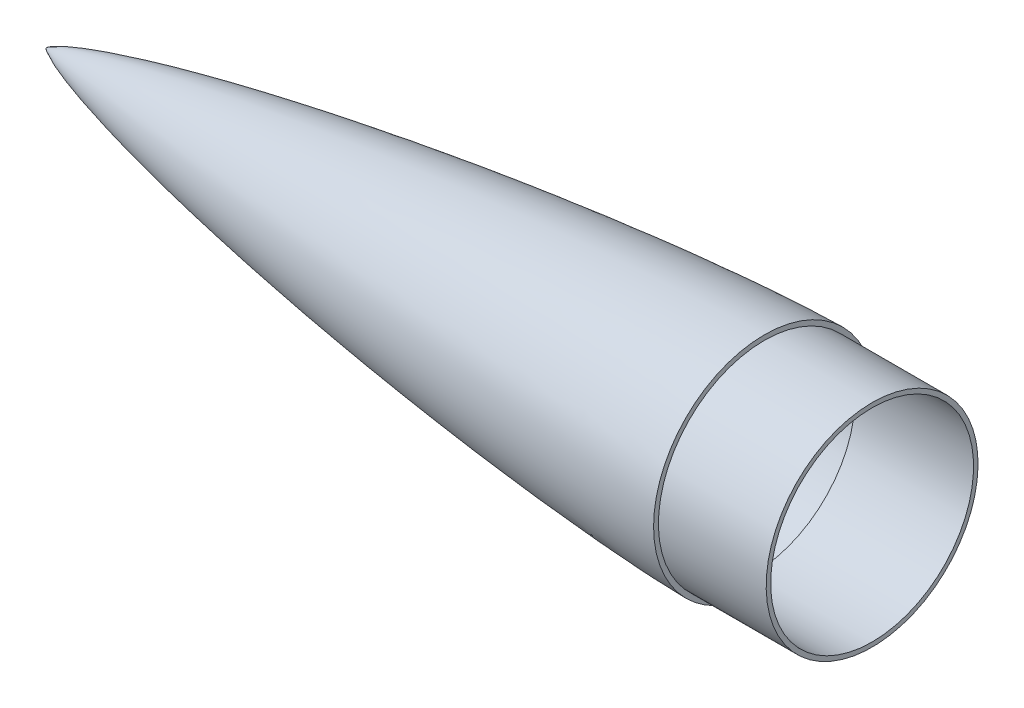
ISO-10303-21;
HEADER;
FILE_DESCRIPTION(('STEP AP214'),'2;1');
FILE_NAME('part.step','',(''),(''),'','','');
FILE_SCHEMA(('AUTOMOTIVE_DESIGN { 1 0 10303 214 1 1 1 1 }'));
ENDSEC;
DATA;
#1=APPLICATION_CONTEXT('core data for automotive mechanical design processes');
#2=APPLICATION_PROTOCOL_DEFINITION('international standard','automotive_design',2000,#1);
#3=PRODUCT_CONTEXT('',#1,'mechanical');
#4=PRODUCT('Part','Part','',(#3));
#5=PRODUCT_RELATED_PRODUCT_CATEGORY('part','',(#4));
#6=PRODUCT_DEFINITION_FORMATION('','',#4);
#7=PRODUCT_DEFINITION_CONTEXT('part definition',#1,'design');
#8=PRODUCT_DEFINITION('design','',#6,#7);
#9=PRODUCT_DEFINITION_SHAPE('','',#8);
#10=(LENGTH_UNIT() NAMED_UNIT(*) SI_UNIT(.MILLI.,.METRE.));
#11=(NAMED_UNIT(*) PLANE_ANGLE_UNIT() SI_UNIT($,.RADIAN.));
#12=(NAMED_UNIT(*) SI_UNIT($,.STERADIAN.) SOLID_ANGLE_UNIT());
#13=UNCERTAINTY_MEASURE_WITH_UNIT(LENGTH_MEASURE(1.E-05),#10,'distance_accuracy_value','');
#14=(GEOMETRIC_REPRESENTATION_CONTEXT(3) GLOBAL_UNCERTAINTY_ASSIGNED_CONTEXT((#13)) GLOBAL_UNIT_ASSIGNED_CONTEXT((#10,
#11,#12)) REPRESENTATION_CONTEXT('',''));
#15=CARTESIAN_POINT('',(0.,0.,0.));
#16=DIRECTION('',(0.,0.,1.));
#17=DIRECTION('',(1.,0.,0.));
#18=AXIS2_PLACEMENT_3D('',#15,#16,#17);
#19=CARTESIAN_POINT('',(6.35000000000002,0.,0.));
#20=CARTESIAN_POINT('',(8.88996624811629,0.941776102994665,0.));
#21=CARTESIAN_POINT('',(14.0024303116031,2.70221944007063,0.));
#22=CARTESIAN_POINT('',(24.4136822795864,5.96497194623063,0.));
#23=CARTESIAN_POINT('',(37.574073752206,9.66592160548296,0.));
#24=CARTESIAN_POINT('',(53.5019918591844,13.7360269665377,0.));
#25=CARTESIAN_POINT('',(74.8515412026572,18.791009133641,0.));
#26=CARTESIAN_POINT('',(101.687004562246,24.5668994346285,0.));
#27=CARTESIAN_POINT('',(134.032795497198,30.8802580053485,0.));
#28=CARTESIAN_POINT('',(166.48159120799,36.6971474107999,0.));
#29=CARTESIAN_POINT('',(209.85174440304,43.8892919328793,0.));
#30=CARTESIAN_POINT('',(264.223227054769,51.9420550282299,0.));
#31=CARTESIAN_POINT('',(329.654722931575,60.2836470172287,0.));
#32=CARTESIAN_POINT('',(384.3074472244,66.1446584278599,0.));
#33=CARTESIAN_POINT('',(428.093023223945,70.1027945695381,0.));
#34=CARTESIAN_POINT('',(460.962543932112,72.6561670831543,0.));
#35=CARTESIAN_POINT('',(485.061674690227,74.1684757365858,0.));
#36=CARTESIAN_POINT('',(498.20512214209,74.8262008817645,0.));
#37=CARTESIAN_POINT('',(500.38,74.93,0.));
#38=B_SPLINE_CURVE_WITH_KNOTS('',3,(#19,#20,#21,#22,#23,#24,#25,#26,#27,#28,#29,#30,#31,#32,#33,
#34,#35,#36,#37),.UNSPECIFIED.,.F.,.F.,(4,1,1,1,1,1,1,1,1,1,1,1,1,1,1,1,4),(0.0272717594964814,
0.0423729523571036,0.0574741452177258,0.0876765309389702,0.117878916660215,0.148081302381459,
0.208486073823948,0.268890845266437,0.329295616708925,0.389700388151414,0.510509931036392,
0.631319473921369,0.752129016806347,0.812533788248836,0.872938559691324,0.933343331133813,
0.945322528899407),.UNSPECIFIED.);
#39=CARTESIAN_POINT('',(508.,0.,0.));
#40=DIRECTION('',(1.,0.,0.));
#41=AXIS1_PLACEMENT('',#39,#40);
#42=SURFACE_OF_REVOLUTION('',#38,#41);
#43=CARTESIAN_POINT('',(500.38,0.,0.));
#44=DIRECTION('',(1.,0.,0.));
#45=DIRECTION('',(0.,1.,0.));
#46=AXIS2_PLACEMENT_3D('',#43,#44,#45);
#47=CIRCLE('',#46,74.9299999999999);
#48=CARTESIAN_POINT('',(500.38,74.93,0.));
#49=VERTEX_POINT('',#48);
#50=EDGE_CURVE('E11',#49,#49,#47,.T.);
#51=ORIENTED_EDGE('',*,*,#50,.T.);
#52=EDGE_LOOP('',(#51));
#53=FACE_BOUND('',#52,.T.);
#54=CARTESIAN_POINT('',(6.35,0.,0.));
#55=VERTEX_POINT('',#54);
#56=VERTEX_LOOP('',#55);
#57=FACE_BOUND('',#56,.T.);
#58=ADVANCED_FACE('F39',(#53,#57),#42,.F.);
#59=CARTESIAN_POINT('',(500.38,74.93,0.));
#60=DIRECTION('',(-1.,0.,0.));
#61=DIRECTION('',(0.,-1.,0.));
#62=AXIS2_PLACEMENT_3D('',#59,#60,#61);
#63=PLANE('',#62);
#64=CARTESIAN_POINT('',(500.38,0.,0.));
#65=DIRECTION('',(1.,0.,0.));
#66=DIRECTION('',(0.,1.,0.));
#67=AXIS2_PLACEMENT_3D('',#64,#65,#66);
#68=CIRCLE('',#67,71.755);
#69=CARTESIAN_POINT('',(500.38,71.7550000000001,0.));
#70=VERTEX_POINT('',#69);
#71=EDGE_CURVE('E48',#70,#70,#68,.T.);
#72=ORIENTED_EDGE('',*,*,#71,.T.);
#73=EDGE_LOOP('',(#72));
#74=FACE_BOUND('',#73,.T.);
#75=ORIENTED_EDGE('',*,*,#50,.F.);
#76=EDGE_LOOP('',(#75));
#77=FACE_BOUND('',#76,.T.);
#78=ADVANCED_FACE('F85',(#74,#77),#63,.T.);
#79=CARTESIAN_POINT('',(508.,0.,0.));
#80=DIRECTION('',(1.,0.,0.));
#81=DIRECTION('',(0.,1.,0.));
#82=AXIS2_PLACEMENT_3D('',#79,#80,#81);
#83=CYLINDRICAL_SURFACE('',#82,71.755);
#84=CARTESIAN_POINT('',(584.2,0.,0.));
#85=DIRECTION('',(1.,0.,0.));
#86=DIRECTION('',(0.,1.,0.));
#87=AXIS2_PLACEMENT_3D('',#84,#85,#86);
#88=CIRCLE('',#87,71.755);
#89=CARTESIAN_POINT('',(584.2,71.7550000000001,0.));
#90=VERTEX_POINT('',#89);
#91=EDGE_CURVE('E78',#90,#90,#88,.T.);
#92=ORIENTED_EDGE('',*,*,#91,.T.);
#93=EDGE_LOOP('',(#92));
#94=FACE_BOUND('',#93,.T.);
#95=ORIENTED_EDGE('',*,*,#71,.F.);
#96=EDGE_LOOP('',(#95));
#97=FACE_BOUND('',#96,.T.);
#98=ADVANCED_FACE('F88',(#94,#97),#83,.F.);
#99=CARTESIAN_POINT('',(584.2,71.7550000000001,0.));
#100=DIRECTION('',(1.,0.,0.));
#101=DIRECTION('',(0.,1.,0.));
#102=AXIS2_PLACEMENT_3D('',#99,#100,#101);
#103=PLANE('',#102);
#104=CARTESIAN_POINT('',(584.2,0.,0.));
#105=DIRECTION('',(1.,0.,0.));
#106=DIRECTION('',(0.,1.,0.));
#107=AXIS2_PLACEMENT_3D('',#104,#105,#106);
#108=CIRCLE('',#107,74.93);
#109=CARTESIAN_POINT('',(584.2,74.9300000000001,0.));
#110=VERTEX_POINT('',#109);
#111=EDGE_CURVE('E68',#110,#110,#108,.T.);
#112=ORIENTED_EDGE('',*,*,#111,.T.);
#113=EDGE_LOOP('',(#112));
#114=FACE_BOUND('',#113,.T.);
#115=ORIENTED_EDGE('',*,*,#91,.F.);
#116=EDGE_LOOP('',(#115));
#117=FACE_BOUND('',#116,.T.);
#118=ADVANCED_FACE('F90',(#114,#117),#103,.T.);
#119=CARTESIAN_POINT('',(508.,0.,0.));
#120=DIRECTION('',(1.,0.,0.));
#121=DIRECTION('',(0.,1.,0.));
#122=AXIS2_PLACEMENT_3D('',#119,#120,#121);
#123=CYLINDRICAL_SURFACE('',#122,74.93);
#124=CARTESIAN_POINT('',(508.,0.,0.));
#125=DIRECTION('',(1.,0.,0.));
#126=DIRECTION('',(0.,1.,0.));
#127=AXIS2_PLACEMENT_3D('',#124,#125,#126);
#128=CIRCLE('',#127,74.93);
#129=CARTESIAN_POINT('',(508.,74.93,0.));
#130=VERTEX_POINT('',#129);
#131=EDGE_CURVE('E64',#130,#130,#128,.T.);
#132=ORIENTED_EDGE('',*,*,#131,.T.);
#133=EDGE_LOOP('',(#132));
#134=FACE_BOUND('',#133,.T.);
#135=ORIENTED_EDGE('',*,*,#111,.F.);
#136=EDGE_LOOP('',(#135));
#137=FACE_BOUND('',#136,.T.);
#138=ADVANCED_FACE('F97',(#134,#137),#123,.T.);
#139=CARTESIAN_POINT('',(508.,78.3590000000001,0.));
#140=DIRECTION('',(1.,0.,0.));
#141=DIRECTION('',(0.,1.,0.));
#142=AXIS2_PLACEMENT_3D('',#139,#140,#141);
#143=PLANE('',#142);
#144=CARTESIAN_POINT('',(508.,0.,0.));
#145=DIRECTION('',(1.,0.,0.));
#146=DIRECTION('',(0.,1.,0.));
#147=AXIS2_PLACEMENT_3D('',#144,#145,#146);
#148=CIRCLE('',#147,78.359);
#149=CARTESIAN_POINT('',(508.,78.3590000000001,0.));
#150=VERTEX_POINT('',#149);
#151=EDGE_CURVE('E61',#150,#150,#148,.T.);
#152=ORIENTED_EDGE('',*,*,#151,.T.);
#153=EDGE_LOOP('',(#152));
#154=FACE_BOUND('',#153,.T.);
#155=ORIENTED_EDGE('',*,*,#131,.F.);
#156=EDGE_LOOP('',(#155));
#157=FACE_BOUND('',#156,.T.);
#158=ADVANCED_FACE('F57',(#154,#157),#143,.T.);
#159=CARTESIAN_POINT('',(508.,78.3590000000001,0.));
#160=CARTESIAN_POINT('',(506.466506538911,78.3533865527715,0.));
#161=CARTESIAN_POINT('',(503.399758723359,78.3100117012018,0.));
#162=CARTESIAN_POINT('',(497.267203511275,78.1743864260998,0.));
#163=CARTESIAN_POINT('',(487.10314335549,77.8358657900895,0.));
#164=CARTESIAN_POINT('',(474.443672774575,77.278006717211,0.));
#165=CARTESIAN_POINT('',(455.262955994451,76.2291909569819,0.));
#166=CARTESIAN_POINT('',(431.103668314105,74.6062080892273,0.));
#167=CARTESIAN_POINT('',(402.943853119389,72.3578215514988,0.));
#168=CARTESIAN_POINT('',(370.797101621952,69.3748151553988,0.));
#169=CARTESIAN_POINT('',(338.687218842143,66.019317565241,0.));
#170=CARTESIAN_POINT('',(306.615943820824,62.3133300043452,0.));
#171=CARTESIAN_POINT('',(274.5859325591,58.266356780265,0.));
#172=CARTESIAN_POINT('',(242.600940750101,53.8774969176258,0.));
#173=CARTESIAN_POINT('',(210.666331668604,49.1355934479413,0.));
#174=CARTESIAN_POINT('',(178.789638073683,44.0179331187811,0.));
#175=CARTESIAN_POINT('',(146.982116690261,38.4855220067454,0.));
#176=CARTESIAN_POINT('',(115.260857412618,32.4757689162783,0.));
#177=CARTESIAN_POINT('',(87.8428395219212,26.7555486962024,0.));
#178=CARTESIAN_POINT('',(64.7152060778741,21.4391039022627,0.));
#179=CARTESIAN_POINT('',(45.6256865676283,16.5950074599223,0.));
#180=CARTESIAN_POINT('',(31.8916232950011,12.776951202506,0.));
#181=CARTESIAN_POINT('',(20.431057710862,9.21610765332268,0.));
#182=CARTESIAN_POINT('',(11.8911471469212,6.1625292191336,0.));
#183=CARTESIAN_POINT('',(6.79215333620263,4.0533986101978,0.));
#184=CARTESIAN_POINT('',(3.92621998198971,2.6863652404464,0.));
#185=CARTESIAN_POINT('',(2.34218930804693,1.82185431551123,0.));
#186=CARTESIAN_POINT('',(1.44479441679255,1.26705539215756,0.));
#187=CARTESIAN_POINT('',(0.914446885529835,0.898448081037934,0.));
#188=CARTESIAN_POINT('',(0.6026241860394,0.656685654001427,0.));
#189=CARTESIAN_POINT('',(0.401947451603213,0.484306452729948,0.));
#190=CARTESIAN_POINT('',(0.274835356304458,0.363880791177355,0.));
#191=CARTESIAN_POINT('',(0.189812425286261,0.276067495807433,0.));
#192=CARTESIAN_POINT('',(0.119222388262843,0.195375450701481,0.));
#193=CARTESIAN_POINT('',(0.0697848330258929,0.13164667774908,0.));
#194=CARTESIAN_POINT('',(0.0315023208899499,0.0740170241349495,0.));
#195=CARTESIAN_POINT('',(0.0101037601756575,0.0330289794366481,0.));
#196=CARTESIAN_POINT('',(0.00282201094841929,0.0112206817663937,0.));
#197=CARTESIAN_POINT('',(0.,0.,0.));
#198=B_SPLINE_CURVE_WITH_KNOTS('',4,(#159,#160,#161,#162,#163,#164,#165,#166,#167,#168,#169,
#170,#171,#172,#173,#174,#175,#176,#177,#178,#179,#180,#181,#182,#183,#184,#185,#186,#187,#188,
#189,#190,#191,#192,#193,#194,#195,#196,#197),.UNSPECIFIED.,.F.,.F.,(5,1,1,1,1,1,1,1,1,1,1,1,1,
1,1,1,1,1,1,1,1,1,1,1,1,1,1,1,1,1,1,1,1,1,1,5),(0.,0.0118867171331606,0.0237734342663212,
0.0475468685326423,0.0788277031398661,0.11010853774709,0.17267020713405,0.235231877354637,
0.297793547291981,0.360355215303574,0.422916887074998,0.485478553803714,0.548040224137599,
0.610601894958506,0.67316356249182,0.735725231832568,0.798286900585068,0.860848559503119,
0.890252526568773,0.919656493634427,0.950937311025142,0.971332253827268,0.983254549434079,
0.989933318504825,0.993691635677172,0.995933780005993,0.997236088462219,0.998107592058293,
0.998695814465024,0.998990858832321,0.999285903199619,0.999464427399714,0.99964295159981,
0.999821475799905,0.999910737899952,1.),.UNSPECIFIED.);
#199=CARTESIAN_POINT('',(508.,0.,0.));
#200=DIRECTION('',(1.,0.,0.));
#201=AXIS1_PLACEMENT('',#199,#200);
#202=SURFACE_OF_REVOLUTION('',#198,#201);
#203=CARTESIAN_POINT('',(0.,0.,0.));
#204=VERTEX_POINT('',#203);
#205=VERTEX_LOOP('',#204);
#206=FACE_BOUND('',#205,.T.);
#207=ORIENTED_EDGE('',*,*,#151,.F.);
#208=EDGE_LOOP('',(#207));
#209=FACE_BOUND('',#208,.T.);
#210=ADVANCED_FACE('F54',(#206,#209),#202,.F.);
#211=CLOSED_SHELL('',(#58,#78,#98,#118,#138,#158,#210));
#212=MANIFOLD_SOLID_BREP('B2',#211);
#213=ADVANCED_BREP_SHAPE_REPRESENTATION('',(#18,#212),#14);
#214=SHAPE_DEFINITION_REPRESENTATION(#9,#213);
ENDSEC;
END-ISO-10303-21;
